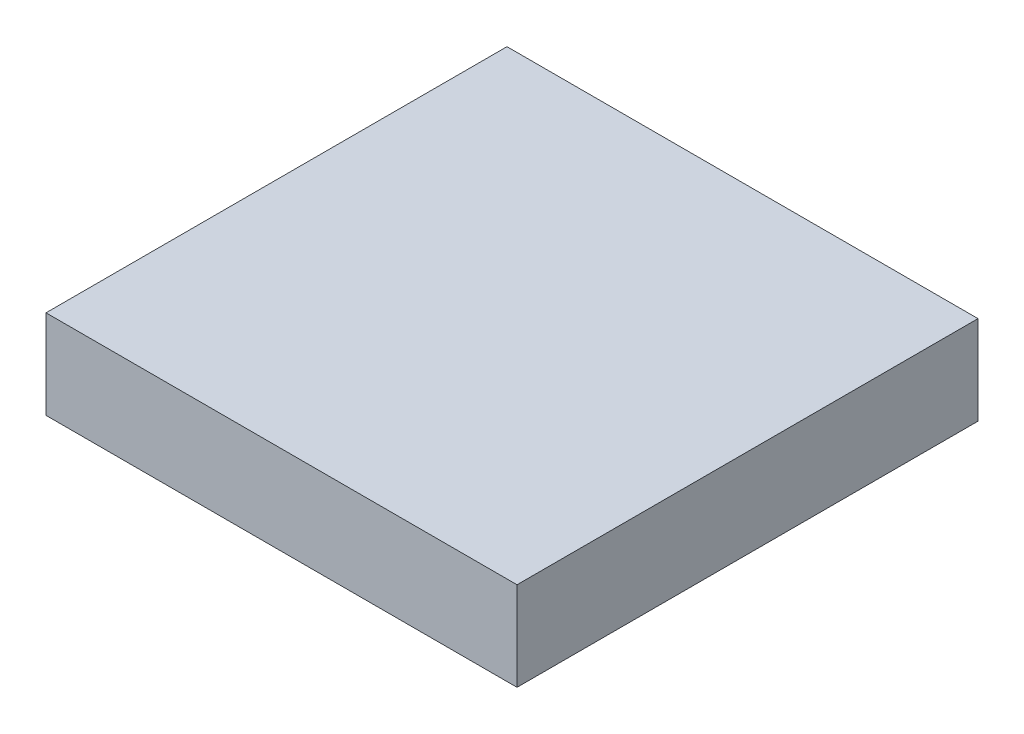
ISO-10303-21;
HEADER;
FILE_DESCRIPTION(('STEP AP214'),'2;1');
FILE_NAME('part.step','',(''),(''),'','','');
FILE_SCHEMA(('AUTOMOTIVE_DESIGN { 1 0 10303 214 1 1 1 1 }'));
ENDSEC;
DATA;
#1=APPLICATION_CONTEXT('core data for automotive mechanical design processes');
#2=APPLICATION_PROTOCOL_DEFINITION('international standard','automotive_design',2000,#1);
#3=PRODUCT_CONTEXT('',#1,'mechanical');
#4=PRODUCT('Part','Part','',(#3));
#5=PRODUCT_RELATED_PRODUCT_CATEGORY('part','',(#4));
#6=PRODUCT_DEFINITION_FORMATION('','',#4);
#7=PRODUCT_DEFINITION_CONTEXT('part definition',#1,'design');
#8=PRODUCT_DEFINITION('design','',#6,#7);
#9=PRODUCT_DEFINITION_SHAPE('','',#8);
#10=(LENGTH_UNIT() NAMED_UNIT(*) SI_UNIT(.MILLI.,.METRE.));
#11=(NAMED_UNIT(*) PLANE_ANGLE_UNIT() SI_UNIT($,.RADIAN.));
#12=(NAMED_UNIT(*) SI_UNIT($,.STERADIAN.) SOLID_ANGLE_UNIT());
#13=UNCERTAINTY_MEASURE_WITH_UNIT(LENGTH_MEASURE(1.E-05),#10,'distance_accuracy_value','');
#14=(GEOMETRIC_REPRESENTATION_CONTEXT(3) GLOBAL_UNCERTAINTY_ASSIGNED_CONTEXT((#13)) GLOBAL_UNIT_ASSIGNED_CONTEXT((#10,
#11,#12)) REPRESENTATION_CONTEXT('',''));
#15=CARTESIAN_POINT('',(0.,0.,0.));
#16=DIRECTION('',(0.,0.,1.));
#17=DIRECTION('',(1.,0.,0.));
#18=AXIS2_PLACEMENT_3D('',#15,#16,#17);
#19=CARTESIAN_POINT('',(91.45,34.5,-89.5));
#20=DIRECTION('',(-1.,0.,0.));
#21=DIRECTION('',(0.,0.,1.));
#22=AXIS2_PLACEMENT_3D('',#19,#20,#21);
#23=PLANE('',#22);
#24=DIRECTION('',(0.,0.,-1.));
#25=VECTOR('',#24,1.);
#26=CARTESIAN_POINT('',(91.45,0.,-89.5));
#27=LINE('',#26,#25);
#28=CARTESIAN_POINT('',(91.45,0.,89.5));
#29=VERTEX_POINT('',#28);
#30=CARTESIAN_POINT('',(91.45,0.,-89.5));
#31=VERTEX_POINT('',#30);
#32=EDGE_CURVE('E113',#29,#31,#27,.T.);
#33=ORIENTED_EDGE('',*,*,#32,.T.);
#34=DIRECTION('',(0.,-1.,0.));
#35=VECTOR('',#34,1.);
#36=CARTESIAN_POINT('',(91.45,34.5,-89.5));
#37=LINE('',#36,#35);
#38=CARTESIAN_POINT('',(91.45,34.5,-89.5));
#39=VERTEX_POINT('',#38);
#40=EDGE_CURVE('E11',#39,#31,#37,.T.);
#41=ORIENTED_EDGE('',*,*,#40,.F.);
#42=DIRECTION('',(0.,0.,-1.));
#43=VECTOR('',#42,1.);
#44=CARTESIAN_POINT('',(91.45,34.5,-89.5));
#45=LINE('',#44,#43);
#46=CARTESIAN_POINT('',(91.45,34.5,89.5));
#47=VERTEX_POINT('',#46);
#48=EDGE_CURVE('E97',#47,#39,#45,.T.);
#49=ORIENTED_EDGE('',*,*,#48,.F.);
#50=DIRECTION('',(0.,-1.,0.));
#51=VECTOR('',#50,1.);
#52=CARTESIAN_POINT('',(91.45,34.5,89.5));
#53=LINE('',#52,#51);
#54=EDGE_CURVE('E109',#47,#29,#53,.T.);
#55=ORIENTED_EDGE('',*,*,#54,.T.);
#56=EDGE_LOOP('',(#33,#41,#49,#55));
#57=FACE_BOUND('',#56,.T.);
#58=ADVANCED_FACE('F45',(#57),#23,.F.);
#59=CARTESIAN_POINT('',(-91.45,34.5,-89.5));
#60=DIRECTION('',(0.,0.,1.));
#61=DIRECTION('',(1.,0.,0.));
#62=AXIS2_PLACEMENT_3D('',#59,#60,#61);
#63=PLANE('',#62);
#64=DIRECTION('',(-1.,0.,0.));
#65=VECTOR('',#64,1.);
#66=CARTESIAN_POINT('',(-91.45,0.,-89.5));
#67=LINE('',#66,#65);
#68=CARTESIAN_POINT('',(-91.45,0.,-89.5));
#69=VERTEX_POINT('',#68);
#70=EDGE_CURVE('E102',#31,#69,#67,.T.);
#71=ORIENTED_EDGE('',*,*,#70,.T.);
#72=DIRECTION('',(0.,-1.,0.));
#73=VECTOR('',#72,1.);
#74=CARTESIAN_POINT('',(-91.45,34.5,-89.5));
#75=LINE('',#74,#73);
#76=CARTESIAN_POINT('',(-91.45,34.5,-89.5));
#77=VERTEX_POINT('',#76);
#78=EDGE_CURVE('E54',#77,#69,#75,.T.);
#79=ORIENTED_EDGE('',*,*,#78,.F.);
#80=DIRECTION('',(-1.,0.,0.));
#81=VECTOR('',#80,1.);
#82=CARTESIAN_POINT('',(-91.45,34.5,-89.5));
#83=LINE('',#82,#81);
#84=EDGE_CURVE('E92',#39,#77,#83,.T.);
#85=ORIENTED_EDGE('',*,*,#84,.F.);
#86=ORIENTED_EDGE('',*,*,#40,.T.);
#87=EDGE_LOOP('',(#71,#79,#85,#86));
#88=FACE_BOUND('',#87,.T.);
#89=ADVANCED_FACE('F101',(#88),#63,.F.);
#90=CARTESIAN_POINT('',(-91.45,34.5,-89.5));
#91=DIRECTION('',(1.,0.,0.));
#92=DIRECTION('',(0.,0.,-1.));
#93=AXIS2_PLACEMENT_3D('',#90,#91,#92);
#94=PLANE('',#93);
#95=DIRECTION('',(0.,0.,1.));
#96=VECTOR('',#95,1.);
#97=CARTESIAN_POINT('',(-91.45,0.,-89.5));
#98=LINE('',#97,#96);
#99=CARTESIAN_POINT('',(-91.45,0.,89.5));
#100=VERTEX_POINT('',#99);
#101=EDGE_CURVE('E79',#69,#100,#98,.T.);
#102=ORIENTED_EDGE('',*,*,#101,.T.);
#103=DIRECTION('',(0.,-1.,0.));
#104=VECTOR('',#103,1.);
#105=CARTESIAN_POINT('',(-91.45,34.5,89.5));
#106=LINE('',#105,#104);
#107=CARTESIAN_POINT('',(-91.45,34.5,89.5));
#108=VERTEX_POINT('',#107);
#109=EDGE_CURVE('E104',#108,#100,#106,.T.);
#110=ORIENTED_EDGE('',*,*,#109,.F.);
#111=DIRECTION('',(0.,0.,1.));
#112=VECTOR('',#111,1.);
#113=CARTESIAN_POINT('',(-91.45,34.5,-89.5));
#114=LINE('',#113,#112);
#115=EDGE_CURVE('E95',#77,#108,#114,.T.);
#116=ORIENTED_EDGE('',*,*,#115,.F.);
#117=ORIENTED_EDGE('',*,*,#78,.T.);
#118=EDGE_LOOP('',(#102,#110,#116,#117));
#119=FACE_BOUND('',#118,.T.);
#120=ADVANCED_FACE('F105',(#119),#94,.F.);
#121=CARTESIAN_POINT('',(-91.45,34.5,89.5));
#122=DIRECTION('',(0.,0.,-1.));
#123=DIRECTION('',(-1.,0.,0.));
#124=AXIS2_PLACEMENT_3D('',#121,#122,#123);
#125=PLANE('',#124);
#126=DIRECTION('',(1.,0.,0.));
#127=VECTOR('',#126,1.);
#128=CARTESIAN_POINT('',(-91.45,0.,89.5));
#129=LINE('',#128,#127);
#130=EDGE_CURVE('E85',#100,#29,#129,.T.);
#131=ORIENTED_EDGE('',*,*,#130,.T.);
#132=ORIENTED_EDGE('',*,*,#54,.F.);
#133=DIRECTION('',(1.,0.,0.));
#134=VECTOR('',#133,1.);
#135=CARTESIAN_POINT('',(-91.45,34.5,89.5));
#136=LINE('',#135,#134);
#137=EDGE_CURVE('E62',#108,#47,#136,.T.);
#138=ORIENTED_EDGE('',*,*,#137,.F.);
#139=ORIENTED_EDGE('',*,*,#109,.T.);
#140=EDGE_LOOP('',(#131,#132,#138,#139));
#141=FACE_BOUND('',#140,.T.);
#142=ADVANCED_FACE('F126',(#141),#125,.F.);
#143=CARTESIAN_POINT('',(0.,34.5,0.));
#144=DIRECTION('',(0.,1.,0.));
#145=DIRECTION('',(0.,0.,1.));
#146=AXIS2_PLACEMENT_3D('',#143,#144,#145);
#147=PLANE('',#146);
#148=ORIENTED_EDGE('',*,*,#48,.T.);
#149=ORIENTED_EDGE('',*,*,#84,.T.);
#150=ORIENTED_EDGE('',*,*,#115,.T.);
#151=ORIENTED_EDGE('',*,*,#137,.T.);
#152=EDGE_LOOP('',(#148,#149,#150,#151));
#153=FACE_BOUND('',#152,.T.);
#154=ADVANCED_FACE('F93',(#153),#147,.T.);
#155=CARTESIAN_POINT('',(0.,0.,0.));
#156=DIRECTION('',(0.,1.,0.));
#157=DIRECTION('',(0.,0.,1.));
#158=AXIS2_PLACEMENT_3D('',#155,#156,#157);
#159=PLANE('',#158);
#160=ORIENTED_EDGE('',*,*,#32,.F.);
#161=ORIENTED_EDGE('',*,*,#130,.F.);
#162=ORIENTED_EDGE('',*,*,#101,.F.);
#163=ORIENTED_EDGE('',*,*,#70,.F.);
#164=EDGE_LOOP('',(#160,#161,#162,#163));
#165=FACE_BOUND('',#164,.T.);
#166=ADVANCED_FACE('F129',(#165),#159,.F.);
#167=CLOSED_SHELL('',(#58,#89,#120,#142,#154,#166));
#168=MANIFOLD_SOLID_BREP('B2',#167);
#169=ADVANCED_BREP_SHAPE_REPRESENTATION('',(#18,#168),#14);
#170=SHAPE_DEFINITION_REPRESENTATION(#9,#169);
ENDSEC;
END-ISO-10303-21;
